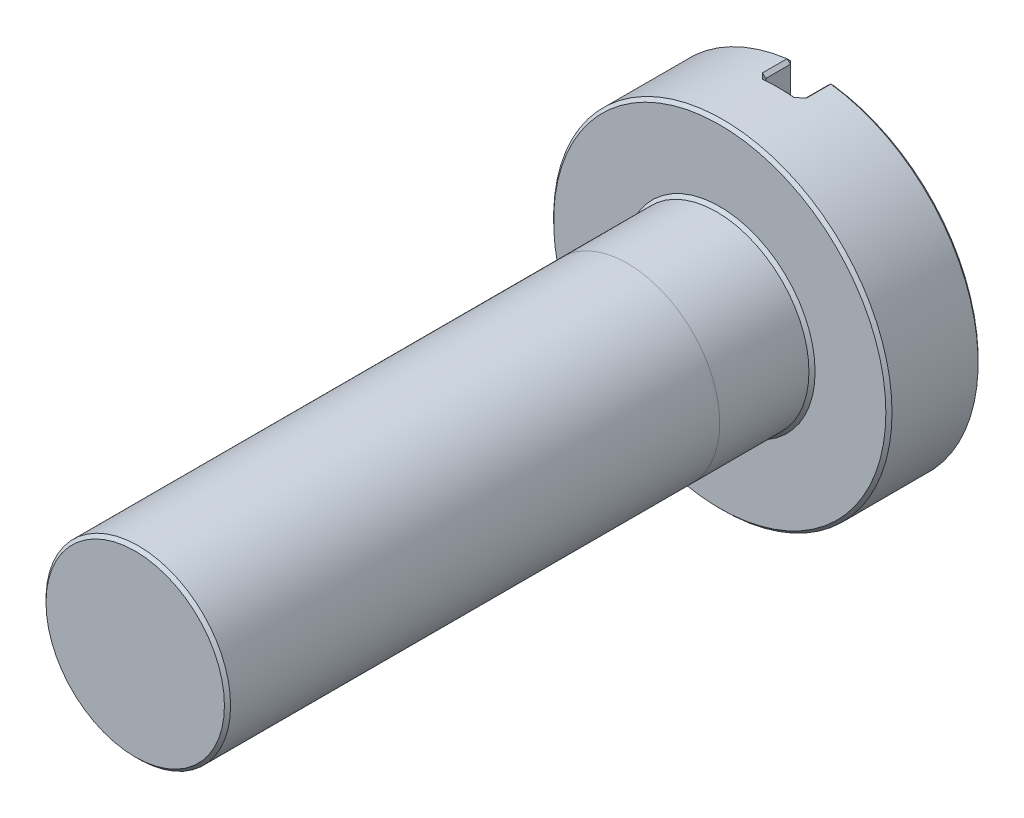
ISO-10303-21;
HEADER;
FILE_DESCRIPTION(('STEP AP214'),'2;1');
FILE_NAME('part.step','',(''),(''),'','','');
FILE_SCHEMA(('AUTOMOTIVE_DESIGN { 1 0 10303 214 1 1 1 1 }'));
ENDSEC;
DATA;
#1=APPLICATION_CONTEXT('core data for automotive mechanical design processes');
#2=APPLICATION_PROTOCOL_DEFINITION('international standard','automotive_design',2000,#1);
#3=PRODUCT_CONTEXT('',#1,'mechanical');
#4=PRODUCT('Part','Part','',(#3));
#5=PRODUCT_RELATED_PRODUCT_CATEGORY('part','',(#4));
#6=PRODUCT_DEFINITION_FORMATION('','',#4);
#7=PRODUCT_DEFINITION_CONTEXT('part definition',#1,'design');
#8=PRODUCT_DEFINITION('design','',#6,#7);
#9=PRODUCT_DEFINITION_SHAPE('','',#8);
#10=(LENGTH_UNIT() NAMED_UNIT(*) SI_UNIT(.MILLI.,.METRE.));
#11=(NAMED_UNIT(*) PLANE_ANGLE_UNIT() SI_UNIT($,.RADIAN.));
#12=(NAMED_UNIT(*) SI_UNIT($,.STERADIAN.) SOLID_ANGLE_UNIT());
#13=UNCERTAINTY_MEASURE_WITH_UNIT(LENGTH_MEASURE(1.E-05),#10,'distance_accuracy_value','');
#14=(GEOMETRIC_REPRESENTATION_CONTEXT(3) GLOBAL_UNCERTAINTY_ASSIGNED_CONTEXT((#13)) GLOBAL_UNIT_ASSIGNED_CONTEXT((#10,
#11,#12)) REPRESENTATION_CONTEXT('',''));
#15=CARTESIAN_POINT('',(0.,0.,0.));
#16=DIRECTION('',(0.,0.,1.));
#17=DIRECTION('',(1.,0.,0.));
#18=AXIS2_PLACEMENT_3D('',#15,#16,#17);
#19=CARTESIAN_POINT('',(0.,0.,11.));
#20=DIRECTION('',(0.,0.,-1.));
#21=DIRECTION('',(-1.,0.,0.));
#22=AXIS2_PLACEMENT_3D('',#19,#20,#21);
#23=CYLINDRICAL_SURFACE('',#22,1.5);
#24=CARTESIAN_POINT('',(0.,0.,10.95));
#25=DIRECTION('',(0.,0.,1.));
#26=DIRECTION('',(1.,0.,0.));
#27=AXIS2_PLACEMENT_3D('',#24,#25,#26);
#28=CIRCLE('',#27,1.5);
#29=CARTESIAN_POINT('',(1.5,0.,10.95));
#30=VERTEX_POINT('',#29);
#31=EDGE_CURVE('E202',#30,#30,#28,.F.);
#32=ORIENTED_EDGE('',*,*,#31,.T.);
#33=EDGE_LOOP('',(#32));
#34=FACE_BOUND('',#33,.T.);
#35=CARTESIAN_POINT('',(0.,0.,3.));
#36=DIRECTION('',(0.,0.,-1.));
#37=DIRECTION('',(0.,1.,0.));
#38=AXIS2_PLACEMENT_3D('',#35,#36,#37);
#39=CIRCLE('',#38,1.5);
#40=CARTESIAN_POINT('',(0.,1.5,3.));
#41=VERTEX_POINT('',#40);
#42=EDGE_CURVE('E11',#41,#41,#39,.T.);
#43=ORIENTED_EDGE('',*,*,#42,.F.);
#44=EDGE_LOOP('',(#43));
#45=FACE_BOUND('',#44,.T.);
#46=ADVANCED_FACE('F39',(#34,#45),#23,.T.);
#47=CARTESIAN_POINT('',(0.,0.,1.5));
#48=DIRECTION('',(0.,0.,-1.));
#49=DIRECTION('',(-1.,0.,0.));
#50=AXIS2_PLACEMENT_3D('',#47,#48,#49);
#51=CYLINDRICAL_SURFACE('',#50,2.75);
#52=CARTESIAN_POINT('',(0.,0.,1.45));
#53=DIRECTION('',(0.,0.,1.));
#54=DIRECTION('',(1.,0.,0.));
#55=AXIS2_PLACEMENT_3D('',#52,#53,#54);
#56=CIRCLE('',#55,2.75);
#57=CARTESIAN_POINT('',(2.75,0.,1.45));
#58=VERTEX_POINT('',#57);
#59=EDGE_CURVE('E49',#58,#58,#56,.F.);
#60=ORIENTED_EDGE('',*,*,#59,.T.);
#61=EDGE_LOOP('',(#60));
#62=FACE_BOUND('',#61,.T.);
#63=CARTESIAN_POINT('',(-0.356481481481479,2.72679683023154,0.450000000000001));
#64=CARTESIAN_POINT('',(-0.347664395842462,2.72794946380013,0.458821927935448));
#65=CARTESIAN_POINT('',(-0.338825123640228,2.7290615860206,0.467627014180514));
#66=CARTESIAN_POINT('',(-0.321099028338335,2.73120398569253,0.485199200221923));
#67=CARTESIAN_POINT('',(-0.312212205212935,2.73223426309969,0.493966299997698));
#68=CARTESIAN_POINT('',(-0.287162841256097,2.73501387422918,0.518548436412304));
#69=CARTESIAN_POINT('',(-0.270942516358511,2.73666902458203,0.534315281910176));
#70=CARTESIAN_POINT('',(-0.254629629631053,2.73818621567523,0.549999999998603));
#71=B_SPLINE_CURVE_WITH_KNOTS('',3,(#63,#64,#65,#66,#67,#68,#69,#70),.UNSPECIFIED.,.F.,.F.,(4,2,
2,4),(0.,0.0375773794297721,0.0751547792021246,0.143195721894395),.UNSPECIFIED.);
#72=CARTESIAN_POINT('',(-0.356481481481479,2.72679683023154,0.450000000000001));
#73=VERTEX_POINT('',#72);
#74=CARTESIAN_POINT('',(-0.254629629629631,2.73818621567538,0.549999999999999));
#75=VERTEX_POINT('',#74);
#76=EDGE_CURVE('E530',#73,#75,#71,.T.);
#77=ORIENTED_EDGE('',*,*,#76,.F.);
#78=DIRECTION('',(0.,0.,-1.));
#79=VECTOR('',#78,1.);
#80=CARTESIAN_POINT('',(-0.356481481481479,2.72679683023154,1.5));
#81=LINE('',#80,#79);
#82=CARTESIAN_POINT('',(-0.356481481481479,2.72679683023154,0.0499999999999997));
#83=VERTEX_POINT('',#82);
#84=EDGE_CURVE('E536',#73,#83,#81,.T.);
#85=ORIENTED_EDGE('',*,*,#84,.T.);
#86=CARTESIAN_POINT('',(0.,0.,0.0499999999999997));
#87=DIRECTION('',(0.,0.,1.));
#88=DIRECTION('',(1.,0.,0.));
#89=AXIS2_PLACEMENT_3D('',#86,#87,#88);
#90=CIRCLE('',#89,2.75);
#91=CARTESIAN_POINT('',(-0.356481481481479,-2.72679683023154,0.0499999999999997));
#92=VERTEX_POINT('',#91);
#93=EDGE_CURVE('E616',#83,#92,#90,.T.);
#94=ORIENTED_EDGE('',*,*,#93,.T.);
#95=DIRECTION('',(0.,0.,-1.));
#96=VECTOR('',#95,1.);
#97=CARTESIAN_POINT('',(-0.356481481481479,-2.72679683023154,1.5));
#98=LINE('',#97,#96);
#99=CARTESIAN_POINT('',(-0.356481481481479,-2.72679683023154,0.450000000000001));
#100=VERTEX_POINT('',#99);
#101=EDGE_CURVE('E578',#92,#100,#98,.F.);
#102=ORIENTED_EDGE('',*,*,#101,.T.);
#103=CARTESIAN_POINT('',(-0.254629629629631,-2.73818621567538,0.549999999999999));
#104=CARTESIAN_POINT('',(-0.263638943794522,-2.73734837041016,0.541338087504837));
#105=CARTESIAN_POINT('',(-0.272619899169562,-2.73646840241962,0.532650874702281));
#106=CARTESIAN_POINT('',(-0.290528422567071,-2.73462508679491,0.515230394982543));
#107=CARTESIAN_POINT('',(-0.299455990634111,-2.73366173923035,0.50649712810382));
#108=CARTESIAN_POINT('',(-0.324478250116621,-2.73083811004551,0.481892309083159));
#109=CARTESIAN_POINT('',(-0.340515929031503,-2.72888381956303,0.465973451196003));
#110=CARTESIAN_POINT('',(-0.356481481481479,-2.72679683023154,0.450000000000001));
#111=B_SPLINE_CURVE_WITH_KNOTS('',3,(#103,#104,#105,#106,#107,#108,#109,#110),.UNSPECIFIED.,.F.,
.F.,(4,2,2,4),(0.,0.0375774596881568,0.0751548880003303,0.143195791124035),.UNSPECIFIED.);
#112=CARTESIAN_POINT('',(-0.254629629629631,-2.73818621567538,0.549999999999999));
#113=VERTEX_POINT('',#112);
#114=EDGE_CURVE('E571',#113,#100,#111,.T.);
#115=ORIENTED_EDGE('',*,*,#114,.F.);
#116=CARTESIAN_POINT('',(0.,0.,0.549999999999999));
#117=DIRECTION('',(0.,0.,-1.));
#118=DIRECTION('',(-1.,0.,0.));
#119=AXIS2_PLACEMENT_3D('',#116,#117,#118);
#120=CIRCLE('',#119,2.75);
#121=CARTESIAN_POINT('',(0.254629629629631,-2.73818621567538,0.549999999999999));
#122=VERTEX_POINT('',#121);
#123=EDGE_CURVE('E630',#113,#122,#120,.F.);
#124=ORIENTED_EDGE('',*,*,#123,.T.);
#125=CARTESIAN_POINT('',(0.35648148148148,-2.72679683023154,0.450000000000001));
#126=CARTESIAN_POINT('',(0.347664395842463,-2.72794946380013,0.458821927935448));
#127=CARTESIAN_POINT('',(0.338825123640229,-2.7290615860206,0.467627014180514));
#128=CARTESIAN_POINT('',(0.321099028338335,-2.73120398569253,0.485199200221923));
#129=CARTESIAN_POINT('',(0.312212205212936,-2.73223426309969,0.493966299997698));
#130=CARTESIAN_POINT('',(0.287162841256098,-2.73501387422918,0.518548436412304));
#131=CARTESIAN_POINT('',(0.270942516358511,-2.73666902458203,0.534315281910176));
#132=CARTESIAN_POINT('',(0.254629629631053,-2.73818621567523,0.549999999998604));
#133=B_SPLINE_CURVE_WITH_KNOTS('',3,(#125,#126,#127,#128,#129,#130,#131,#132),.UNSPECIFIED.,.F.,
.F.,(4,2,2,4),(0.,0.0375773794297721,0.0751547792021247,0.143195721894396),.UNSPECIFIED.);
#134=CARTESIAN_POINT('',(0.35648148148148,-2.72679683023154,0.450000000000001));
#135=VERTEX_POINT('',#134);
#136=EDGE_CURVE('E146',#135,#122,#133,.T.);
#137=ORIENTED_EDGE('',*,*,#136,.F.);
#138=DIRECTION('',(0.,0.,-1.));
#139=VECTOR('',#138,1.);
#140=CARTESIAN_POINT('',(0.35648148148148,-2.72679683023154,1.5));
#141=LINE('',#140,#139);
#142=CARTESIAN_POINT('',(0.35648148148148,-2.72679683023154,0.0499999999999997));
#143=VERTEX_POINT('',#142);
#144=EDGE_CURVE('E141',#135,#143,#141,.T.);
#145=ORIENTED_EDGE('',*,*,#144,.T.);
#146=CARTESIAN_POINT('',(0.,0.,0.0499999999999997));
#147=DIRECTION('',(0.,0.,1.));
#148=DIRECTION('',(1.,0.,0.));
#149=AXIS2_PLACEMENT_3D('',#146,#147,#148);
#150=CIRCLE('',#149,2.75);
#151=CARTESIAN_POINT('',(0.356481481481479,2.72679683023154,0.0499999999999997));
#152=VERTEX_POINT('',#151);
#153=EDGE_CURVE('E144',#143,#152,#150,.T.);
#154=ORIENTED_EDGE('',*,*,#153,.T.);
#155=DIRECTION('',(0.,0.,-1.));
#156=VECTOR('',#155,1.);
#157=CARTESIAN_POINT('',(0.356481481481479,2.72679683023154,1.5));
#158=LINE('',#157,#156);
#159=CARTESIAN_POINT('',(0.356481481481479,2.72679683023154,0.450000000000001));
#160=VERTEX_POINT('',#159);
#161=EDGE_CURVE('E151',#152,#160,#158,.F.);
#162=ORIENTED_EDGE('',*,*,#161,.T.);
#163=CARTESIAN_POINT('',(0.254629629629631,2.73818621567538,0.549999999999999));
#164=CARTESIAN_POINT('',(0.263638943794522,2.73734837041016,0.541338087504837));
#165=CARTESIAN_POINT('',(0.272619899169562,2.73646840241962,0.532650874702281));
#166=CARTESIAN_POINT('',(0.290528422567071,2.73462508679491,0.515230394982543));
#167=CARTESIAN_POINT('',(0.299455990634111,2.73366173923035,0.50649712810382));
#168=CARTESIAN_POINT('',(0.324478250116621,2.73083811004551,0.481892309083159));
#169=CARTESIAN_POINT('',(0.340515929031503,2.72888381956303,0.465973451196003));
#170=CARTESIAN_POINT('',(0.356481481481479,2.72679683023154,0.450000000000001));
#171=B_SPLINE_CURVE_WITH_KNOTS('',3,(#163,#164,#165,#166,#167,#168,#169,#170),.UNSPECIFIED.,.F.,
.F.,(4,2,2,4),(0.,0.0375774596881568,0.0751548880003303,0.143195791124035),.UNSPECIFIED.);
#172=CARTESIAN_POINT('',(0.254629629629631,2.73818621567538,0.549999999999999));
#173=VERTEX_POINT('',#172);
#174=EDGE_CURVE('E564',#173,#160,#171,.T.);
#175=ORIENTED_EDGE('',*,*,#174,.F.);
#176=CARTESIAN_POINT('',(0.,0.,0.549999999999999));
#177=DIRECTION('',(0.,0.,-1.));
#178=DIRECTION('',(-1.,0.,0.));
#179=AXIS2_PLACEMENT_3D('',#176,#177,#178);
#180=CIRCLE('',#179,2.75);
#181=EDGE_CURVE('E410',#173,#75,#180,.F.);
#182=ORIENTED_EDGE('',*,*,#181,.T.);
#183=EDGE_LOOP('',(#77,#85,#94,#102,#115,#124,#137,#145,#154,#162,#175,#182));
#184=FACE_BOUND('',#183,.T.);
#185=ADVANCED_FACE('F143',(#62,#184),#51,.T.);
#186=CARTESIAN_POINT('',(0.,0.,0.));
#187=DIRECTION('',(0.,0.,1.));
#188=DIRECTION('',(1.,0.,0.));
#189=AXIS2_PLACEMENT_3D('',#186,#187,#188);
#190=PLANE('',#189);
#191=CARTESIAN_POINT('',(0.,0.,0.));
#192=DIRECTION('',(0.,0.,1.));
#193=DIRECTION('',(1.,0.,0.));
#194=AXIS2_PLACEMENT_3D('',#191,#192,#193);
#195=CIRCLE('',#194,2.7);
#196=CARTESIAN_POINT('',(0.35,2.67721870604551,0.));
#197=VERTEX_POINT('',#196);
#198=CARTESIAN_POINT('',(0.35,-2.67721870604551,0.));
#199=VERTEX_POINT('',#198);
#200=EDGE_CURVE('E55',#197,#199,#195,.F.);
#201=ORIENTED_EDGE('',*,*,#200,.T.);
#202=DIRECTION('',(0.,1.,0.));
#203=VECTOR('',#202,1.);
#204=CARTESIAN_POINT('',(0.35,0.,0.));
#205=LINE('',#204,#203);
#206=EDGE_CURVE('E199',#199,#197,#205,.T.);
#207=ORIENTED_EDGE('',*,*,#206,.T.);
#208=EDGE_LOOP('',(#201,#207));
#209=FACE_BOUND('',#208,.T.);
#210=ADVANCED_FACE('F234',(#209),#190,.F.);
#211=ORIENTED_EDGE('',*,*,#42,.T.);
#212=EDGE_LOOP('',(#211));
#213=FACE_BOUND('',#212,.T.);
#214=CARTESIAN_POINT('',(0.,0.,1.55));
#215=DIRECTION('',(0.,0.,1.));
#216=DIRECTION('',(1.,0.,0.));
#217=AXIS2_PLACEMENT_3D('',#214,#215,#216);
#218=CIRCLE('',#217,1.5);
#219=CARTESIAN_POINT('',(1.5,0.,1.55));
#220=VERTEX_POINT('',#219);
#221=EDGE_CURVE('E198',#220,#220,#218,.T.);
#222=ORIENTED_EDGE('',*,*,#221,.T.);
#223=EDGE_LOOP('',(#222));
#224=FACE_BOUND('',#223,.T.);
#225=ADVANCED_FACE('F232',(#213,#224),#23,.T.);
#226=CARTESIAN_POINT('',(0.,0.,11.));
#227=DIRECTION('',(0.,0.,1.));
#228=DIRECTION('',(1.,0.,0.));
#229=AXIS2_PLACEMENT_3D('',#226,#227,#228);
#230=PLANE('',#229);
#231=CARTESIAN_POINT('',(0.,0.,11.));
#232=DIRECTION('',(0.,0.,1.));
#233=DIRECTION('',(1.,0.,0.));
#234=AXIS2_PLACEMENT_3D('',#231,#232,#233);
#235=CIRCLE('',#234,1.45);
#236=CARTESIAN_POINT('',(1.45,0.,11.));
#237=VERTEX_POINT('',#236);
#238=EDGE_CURVE('E195',#237,#237,#235,.T.);
#239=ORIENTED_EDGE('',*,*,#238,.T.);
#240=EDGE_LOOP('',(#239));
#241=FACE_BOUND('',#240,.T.);
#242=ADVANCED_FACE('F224',(#241),#230,.T.);
#243=CARTESIAN_POINT('',(0.,0.,1.5));
#244=DIRECTION('',(0.,0.,1.));
#245=DIRECTION('',(1.,0.,0.));
#246=AXIS2_PLACEMENT_3D('',#243,#244,#245);
#247=PLANE('',#246);
#248=CARTESIAN_POINT('',(0.,0.,1.5));
#249=DIRECTION('',(0.,0.,1.));
#250=DIRECTION('',(1.,0.,0.));
#251=AXIS2_PLACEMENT_3D('',#248,#249,#250);
#252=CIRCLE('',#251,2.7);
#253=CARTESIAN_POINT('',(2.7,0.,1.5));
#254=VERTEX_POINT('',#253);
#255=EDGE_CURVE('E208',#254,#254,#252,.T.);
#256=ORIENTED_EDGE('',*,*,#255,.T.);
#257=EDGE_LOOP('',(#256));
#258=FACE_BOUND('',#257,.T.);
#259=CARTESIAN_POINT('',(0.,0.,1.5));
#260=DIRECTION('',(0.,0.,1.));
#261=DIRECTION('',(1.,0.,0.));
#262=AXIS2_PLACEMENT_3D('',#259,#260,#261);
#263=CIRCLE('',#262,1.55);
#264=CARTESIAN_POINT('',(1.55,0.,1.5));
#265=VERTEX_POINT('',#264);
#266=EDGE_CURVE('E205',#265,#265,#263,.F.);
#267=ORIENTED_EDGE('',*,*,#266,.T.);
#268=EDGE_LOOP('',(#267));
#269=FACE_BOUND('',#268,.T.);
#270=ADVANCED_FACE('F220',(#258,#269),#247,.T.);
#271=CARTESIAN_POINT('',(0.,0.,0.));
#272=DIRECTION('',(0.,0.,1.));
#273=DIRECTION('',(1.,0.,0.));
#274=AXIS2_PLACEMENT_3D('',#271,#272,#273);
#275=CIRCLE('',#274,2.7);
#276=CARTESIAN_POINT('',(-0.35,-2.67721870604551,0.));
#277=VERTEX_POINT('',#276);
#278=CARTESIAN_POINT('',(-0.35,2.67721870604551,0.));
#279=VERTEX_POINT('',#278);
#280=EDGE_CURVE('E428',#277,#279,#275,.F.);
#281=ORIENTED_EDGE('',*,*,#280,.T.);
#282=DIRECTION('',(0.,-1.,0.));
#283=VECTOR('',#282,1.);
#284=CARTESIAN_POINT('',(-0.35,0.,0.));
#285=LINE('',#284,#283);
#286=EDGE_CURVE('E430',#279,#277,#285,.T.);
#287=ORIENTED_EDGE('',*,*,#286,.T.);
#288=EDGE_LOOP('',(#281,#287));
#289=FACE_BOUND('',#288,.T.);
#290=ADVANCED_FACE('F223',(#289),#190,.F.);
#291=CARTESIAN_POINT('',(0.,0.,0.5));
#292=DIRECTION('',(0.,0.,-1.));
#293=DIRECTION('',(-1.,0.,0.));
#294=AXIS2_PLACEMENT_3D('',#291,#292,#293);
#295=PLANE('',#294);
#296=CARTESIAN_POINT('',(0.,0.,0.5));
#297=DIRECTION('',(0.,0.,-1.));
#298=DIRECTION('',(-1.,0.,0.));
#299=AXIS2_PLACEMENT_3D('',#296,#297,#298);
#300=CIRCLE('',#299,2.7);
#301=CARTESIAN_POINT('',(0.250000000000002,-2.68840101175402,0.5));
#302=VERTEX_POINT('',#301);
#303=CARTESIAN_POINT('',(-0.250000000000002,-2.68840101175402,0.5));
#304=VERTEX_POINT('',#303);
#305=EDGE_CURVE('E419',#302,#304,#300,.T.);
#306=ORIENTED_EDGE('',*,*,#305,.T.);
#307=DIRECTION('',(0.,1.,0.));
#308=VECTOR('',#307,1.);
#309=CARTESIAN_POINT('',(-0.250000000000002,0.,0.5));
#310=LINE('',#309,#308);
#311=CARTESIAN_POINT('',(-0.250000000000002,2.68840101175402,0.5));
#312=VERTEX_POINT('',#311);
#313=EDGE_CURVE('E421',#304,#312,#310,.T.);
#314=ORIENTED_EDGE('',*,*,#313,.T.);
#315=CARTESIAN_POINT('',(0.,0.,0.5));
#316=DIRECTION('',(0.,0.,-1.));
#317=DIRECTION('',(-1.,0.,0.));
#318=AXIS2_PLACEMENT_3D('',#315,#316,#317);
#319=CIRCLE('',#318,2.7);
#320=CARTESIAN_POINT('',(0.250000000000002,2.68840101175402,0.5));
#321=VERTEX_POINT('',#320);
#322=EDGE_CURVE('E408',#312,#321,#319,.T.);
#323=ORIENTED_EDGE('',*,*,#322,.T.);
#324=DIRECTION('',(0.,-1.,0.));
#325=VECTOR('',#324,1.);
#326=CARTESIAN_POINT('',(0.250000000000002,0.,0.5));
#327=LINE('',#326,#325);
#328=EDGE_CURVE('E416',#321,#302,#327,.T.);
#329=ORIENTED_EDGE('',*,*,#328,.T.);
#330=EDGE_LOOP('',(#306,#314,#323,#329));
#331=FACE_BOUND('',#330,.T.);
#332=ADVANCED_FACE('F666',(#331),#295,.T.);
#333=CARTESIAN_POINT('',(0.3,-2.97219755952938,0.5));
#334=DIRECTION('',(1.,0.,0.));
#335=DIRECTION('',(0.,0.,-1.));
#336=AXIS2_PLACEMENT_3D('',#333,#334,#335);
#337=PLANE('',#336);
#338=DIRECTION('',(0.,0.,1.));
#339=VECTOR('',#338,1.);
#340=CARTESIAN_POINT('',(0.3,-2.67721870604551,0.5));
#341=LINE('',#340,#339);
#342=CARTESIAN_POINT('',(0.3,-2.67721870604551,0.0499999999999997));
#343=VERTEX_POINT('',#342);
#344=CARTESIAN_POINT('',(0.3,-2.67721870604551,0.450000000000001));
#345=VERTEX_POINT('',#344);
#346=EDGE_CURVE('E171',#343,#345,#341,.T.);
#347=ORIENTED_EDGE('',*,*,#346,.T.);
#348=DIRECTION('',(0.,1.,0.));
#349=VECTOR('',#348,1.);
#350=CARTESIAN_POINT('',(0.3,-2.97219755952938,0.450000000000001));
#351=LINE('',#350,#349);
#352=CARTESIAN_POINT('',(0.3,2.67721870604551,0.450000000000001));
#353=VERTEX_POINT('',#352);
#354=EDGE_CURVE('E423',#345,#353,#351,.T.);
#355=ORIENTED_EDGE('',*,*,#354,.T.);
#356=DIRECTION('',(0.,0.,-1.));
#357=VECTOR('',#356,1.);
#358=CARTESIAN_POINT('',(0.3,2.67721870604551,0.5));
#359=LINE('',#358,#357);
#360=CARTESIAN_POINT('',(0.3,2.67721870604551,0.0499999999999997));
#361=VERTEX_POINT('',#360);
#362=EDGE_CURVE('E656',#353,#361,#359,.T.);
#363=ORIENTED_EDGE('',*,*,#362,.T.);
#364=DIRECTION('',(0.,-1.,0.));
#365=VECTOR('',#364,1.);
#366=CARTESIAN_POINT('',(0.3,-2.97219755952938,0.0499999999999997));
#367=LINE('',#366,#365);
#368=EDGE_CURVE('E652',#361,#343,#367,.T.);
#369=ORIENTED_EDGE('',*,*,#368,.T.);
#370=EDGE_LOOP('',(#347,#355,#363,#369));
#371=FACE_BOUND('',#370,.T.);
#372=ADVANCED_FACE('F660',(#371),#337,.F.);
#373=CARTESIAN_POINT('',(-0.3,-2.97219755952938,0.5));
#374=DIRECTION('',(-1.,0.,0.));
#375=DIRECTION('',(0.,0.,1.));
#376=AXIS2_PLACEMENT_3D('',#373,#374,#375);
#377=PLANE('',#376);
#378=DIRECTION('',(0.,0.,1.));
#379=VECTOR('',#378,1.);
#380=CARTESIAN_POINT('',(-0.3,2.67721870604551,0.5));
#381=LINE('',#380,#379);
#382=CARTESIAN_POINT('',(-0.3,2.67721870604551,0.0499999999999997));
#383=VERTEX_POINT('',#382);
#384=CARTESIAN_POINT('',(-0.3,2.67721870604551,0.450000000000001));
#385=VERTEX_POINT('',#384);
#386=EDGE_CURVE('E538',#383,#385,#381,.T.);
#387=ORIENTED_EDGE('',*,*,#386,.T.);
#388=DIRECTION('',(0.,-1.,0.));
#389=VECTOR('',#388,1.);
#390=CARTESIAN_POINT('',(-0.3,-2.97219755952938,0.450000000000001));
#391=LINE('',#390,#389);
#392=CARTESIAN_POINT('',(-0.3,-2.67721870604551,0.450000000000001));
#393=VERTEX_POINT('',#392);
#394=EDGE_CURVE('E650',#385,#393,#391,.T.);
#395=ORIENTED_EDGE('',*,*,#394,.T.);
#396=DIRECTION('',(0.,0.,-1.));
#397=VECTOR('',#396,1.);
#398=CARTESIAN_POINT('',(-0.3,-2.67721870604551,0.5));
#399=LINE('',#398,#397);
#400=CARTESIAN_POINT('',(-0.3,-2.67721870604551,0.0499999999999997));
#401=VERTEX_POINT('',#400);
#402=EDGE_CURVE('E648',#393,#401,#399,.T.);
#403=ORIENTED_EDGE('',*,*,#402,.T.);
#404=DIRECTION('',(0.,1.,0.));
#405=VECTOR('',#404,1.);
#406=CARTESIAN_POINT('',(-0.3,-2.97219755952938,0.0499999999999997));
#407=LINE('',#406,#405);
#408=EDGE_CURVE('E535',#401,#383,#407,.T.);
#409=ORIENTED_EDGE('',*,*,#408,.T.);
#410=EDGE_LOOP('',(#387,#395,#403,#409));
#411=FACE_BOUND('',#410,.T.);
#412=ADVANCED_FACE('F284',(#411),#377,.F.);
#413=CARTESIAN_POINT('',(0.3,2.67721870604551,0.0499999999999997));
#414=DIRECTION('',(-0.550659428732147,0.627334350324258,-0.550659428732158));
#415=DIRECTION('',(0.,0.659685671502122,0.751541625470469));
#416=AXIS2_PLACEMENT_3D('',#413,#414,#415);
#417=PLANE('',#416);
#418=DIRECTION('',(0.751541625470475,0.659685671502115,0.));
#419=VECTOR('',#418,1.);
#420=CARTESIAN_POINT('',(0.3,2.67721870604551,0.0499999999999997));
#421=LINE('',#420,#419);
#422=EDGE_CURVE('E167',#152,#361,#421,.F.);
#423=ORIENTED_EDGE('',*,*,#422,.F.);
#424=DIRECTION('',(-0.091661990153784,-0.701140556208987,-0.707106781186547));
#425=VECTOR('',#424,1.);
#426=CARTESIAN_POINT('',(0.,0.,-2.69999999999996));
#427=LINE('',#426,#425);
#428=EDGE_CURVE('E157',#197,#152,#427,.F.);
#429=ORIENTED_EDGE('',*,*,#428,.F.);
#430=DIRECTION('',(0.707106781186548,0.,-0.707106781186548));
#431=VECTOR('',#430,1.);
#432=CARTESIAN_POINT('',(0.3,2.67721870604551,0.0499999999999997));
#433=LINE('',#432,#431);
#434=EDGE_CURVE('E191',#361,#197,#433,.T.);
#435=ORIENTED_EDGE('',*,*,#434,.F.);
#436=EDGE_LOOP('',(#423,#429,#435));
#437=FACE_BOUND('',#436,.T.);
#438=ADVANCED_FACE('F273',(#437),#417,.T.);
#439=CARTESIAN_POINT('',(0.,0.,0.0499999999999997));
#440=DIRECTION('',(0.,0.,1.));
#441=DIRECTION('',(1.,0.,0.));
#442=AXIS2_PLACEMENT_3D('',#439,#440,#441);
#443=CONICAL_SURFACE('',#442,2.75,0.785398163397448);
#444=ORIENTED_EDGE('',*,*,#428,.T.);
#445=ORIENTED_EDGE('',*,*,#153,.F.);
#446=DIRECTION('',(0.0916619901537935,-0.701140556208986,0.707106781186547));
#447=VECTOR('',#446,1.);
#448=CARTESIAN_POINT('',(0.,0.,-2.69999999999998));
#449=LINE('',#448,#447);
#450=EDGE_CURVE('E155',#199,#143,#449,.T.);
#451=ORIENTED_EDGE('',*,*,#450,.F.);
#452=ORIENTED_EDGE('',*,*,#200,.F.);
#453=EDGE_LOOP('',(#444,#445,#451,#452));
#454=FACE_BOUND('',#453,.T.);
#455=ADVANCED_FACE('F154',(#454),#443,.T.);
#456=CARTESIAN_POINT('',(0.35,0.,0.));
#457=DIRECTION('',(0.707106781186548,0.,0.707106781186548));
#458=DIRECTION('',(0.,1.,0.));
#459=AXIS2_PLACEMENT_3D('',#456,#457,#458);
#460=PLANE('',#459);
#461=ORIENTED_EDGE('',*,*,#434,.T.);
#462=ORIENTED_EDGE('',*,*,#206,.F.);
#463=DIRECTION('',(-0.707106781186548,0.,0.707106781186548));
#464=VECTOR('',#463,1.);
#465=CARTESIAN_POINT('',(0.328240740740739,-2.67721870604551,0.0217592592592606));
#466=LINE('',#465,#464);
#467=EDGE_CURVE('E166',#343,#199,#466,.F.);
#468=ORIENTED_EDGE('',*,*,#467,.F.);
#469=ORIENTED_EDGE('',*,*,#368,.F.);
#470=EDGE_LOOP('',(#461,#462,#468,#469));
#471=FACE_BOUND('',#470,.T.);
#472=ADVANCED_FACE('F291',(#471),#460,.F.);
#473=CARTESIAN_POINT('',(0.356481481481479,2.72679683023154,1.5));
#474=DIRECTION('',(-0.659685671502115,0.751541625470475,0.));
#475=DIRECTION('',(0.,0.,-1.));
#476=AXIS2_PLACEMENT_3D('',#473,#474,#475);
#477=PLANE('',#476);
#478=ORIENTED_EDGE('',*,*,#422,.T.);
#479=ORIENTED_EDGE('',*,*,#362,.F.);
#480=DIRECTION('',(-0.751541625470475,-0.659685671502115,0.));
#481=VECTOR('',#480,1.);
#482=CARTESIAN_POINT('',(0.356481481481479,2.72679683023154,0.450000000000001));
#483=LINE('',#482,#481);
#484=EDGE_CURVE('E172',#160,#353,#483,.T.);
#485=ORIENTED_EDGE('',*,*,#484,.F.);
#486=ORIENTED_EDGE('',*,*,#161,.F.);
#487=EDGE_LOOP('',(#478,#479,#485,#486));
#488=FACE_BOUND('',#487,.T.);
#489=ADVANCED_FACE('F297',(#488),#477,.T.);
#490=CARTESIAN_POINT('',(0.35648148148148,-2.72679683023154,0.0499999999999997));
#491=DIRECTION('',(-0.550659428732137,-0.627334350324266,-0.550659428732159));
#492=DIRECTION('',(0.,0.659685671502118,-0.751541625470472));
#493=AXIS2_PLACEMENT_3D('',#490,#491,#492);
#494=PLANE('',#493);
#495=ORIENTED_EDGE('',*,*,#467,.T.);
#496=ORIENTED_EDGE('',*,*,#450,.T.);
#497=DIRECTION('',(0.751541625470485,-0.659685671502103,0.));
#498=VECTOR('',#497,1.);
#499=CARTESIAN_POINT('',(0.35648148148148,-2.72679683023154,0.0499999999999997));
#500=LINE('',#499,#498);
#501=EDGE_CURVE('E163',#343,#143,#500,.T.);
#502=ORIENTED_EDGE('',*,*,#501,.F.);
#503=EDGE_LOOP('',(#495,#496,#502));
#504=FACE_BOUND('',#503,.T.);
#505=ADVANCED_FACE('F162',(#504),#494,.T.);
#506=CARTESIAN_POINT('',(0.250000000000002,2.68840101175402,0.5));
#507=CARTESIAN_POINT('',(0.3,2.67721870604551,0.450000000000001));
#508=CARTESIAN_POINT('',(0.254629629629631,2.73818621567538,0.549999999999999));
#509=CARTESIAN_POINT('',(0.356481481481479,2.72679683023154,0.450000000000001));
#510=CARTESIAN_POINT('',(0.254700493957954,2.73894826260323,0.550765334745886));
#511=CARTESIAN_POINT('',(0.357346026287019,2.72755570745305,0.450000000000001));
#512=B_SPLINE_SURFACE_WITH_KNOTS('',1,1,((#506,#507),(#508,#509),(#510,#511)),.UNSPECIFIED.,.F.,
.F.,.F.,(2,1,2),(2,2),(0.,1.,1.01530669491775),(0.,1.),.UNSPECIFIED.);
#513=CARTESIAN_POINT('',(0.3,2.67721870604551,0.450000000000001));
#514=CARTESIAN_POINT('',(0.295625856762105,2.67819696618349,0.454374143237896));
#515=CARTESIAN_POINT('',(0.29125171352421,2.67917522632147,0.458748286475791));
#516=CARTESIAN_POINT('',(0.28250342704842,2.68113174659743,0.467496572951582));
#517=CARTESIAN_POINT('',(0.278129283810525,2.68211000673541,0.471870716189477));
#518=CARTESIAN_POINT('',(0.265836760381754,2.68485918183359,0.484163239618248));
#519=CARTESIAN_POINT('',(0.257918380190878,2.68663009679381,0.492081619809124));
#520=CARTESIAN_POINT('',(0.250000000000002,2.68840101175402,0.5));
#521=B_SPLINE_CURVE_WITH_KNOTS('',3,(#513,#514,#515,#516,#517,#518,#519,#520),.UNSPECIFIED.,.F.,
.F.,(4,2,2,4),(0.,0.0187885406367615,0.037577081273523,0.071589412352373),.UNSPECIFIED.);
#522=EDGE_CURVE('E173',#321,#353,#521,.F.);
#523=DIRECTION('',(0.0654728501098652,0.704069105911116,0.707106781186556));
#524=VECTOR('',#523,1.);
#525=CARTESIAN_POINT('',(0.250000000000002,2.68840101175402,0.5));
#526=LINE('',#525,#524);
#527=EDGE_CURVE('E178',#173,#321,#526,.F.);
#528=ORIENTED_EDGE('',*,*,#174,.T.);
#529=ORIENTED_EDGE('',*,*,#484,.T.);
#530=ORIENTED_EDGE('',*,*,#522,.F.);
#531=ORIENTED_EDGE('',*,*,#527,.F.);
#532=EDGE_LOOP('',(#528,#529,#530,#531));
#533=FACE_BOUND('',#532,.T.);
#534=ADVANCED_FACE('F310',(#533),#512,.T.);
#535=CARTESIAN_POINT('',(0.35648148148148,-2.72679683023154,1.5));
#536=DIRECTION('',(0.659685671502103,0.751541625470485,0.));
#537=DIRECTION('',(0.,0.,-1.));
#538=AXIS2_PLACEMENT_3D('',#535,#536,#537);
#539=PLANE('',#538);
#540=ORIENTED_EDGE('',*,*,#501,.T.);
#541=ORIENTED_EDGE('',*,*,#144,.F.);
#542=DIRECTION('',(0.751541625470485,-0.659685671502103,0.));
#543=VECTOR('',#542,1.);
#544=CARTESIAN_POINT('',(0.3,-2.67721870604551,0.450000000000001));
#545=LINE('',#544,#543);
#546=EDGE_CURVE('E396',#345,#135,#545,.T.);
#547=ORIENTED_EDGE('',*,*,#546,.F.);
#548=ORIENTED_EDGE('',*,*,#346,.F.);
#549=EDGE_LOOP('',(#540,#541,#547,#548));
#550=FACE_BOUND('',#549,.T.);
#551=ADVANCED_FACE('F169',(#550),#539,.F.);
#552=CARTESIAN_POINT('',(0.250000000000002,0.,0.5));
#553=DIRECTION('',(0.707106781186554,0.,0.707106781186541));
#554=DIRECTION('',(0.,-1.,0.));
#555=AXIS2_PLACEMENT_3D('',#552,#553,#554);
#556=PLANE('',#555);
#557=ORIENTED_EDGE('',*,*,#522,.T.);
#558=ORIENTED_EDGE('',*,*,#354,.F.);
#559=CARTESIAN_POINT('',(0.250000000000002,-2.68840101175402,0.5));
#560=CARTESIAN_POINT('',(0.254374143237897,-2.68742275161604,0.495625856762105));
#561=CARTESIAN_POINT('',(0.258748286475792,-2.68644449147806,0.49125171352421));
#562=CARTESIAN_POINT('',(0.267496572951582,-2.6844879712021,0.482503427048419));
#563=CARTESIAN_POINT('',(0.271870716189477,-2.68350971106412,0.478129283810524));
#564=CARTESIAN_POINT('',(0.284163239618248,-2.68076053596593,0.465836760381753));
#565=CARTESIAN_POINT('',(0.292081619809124,-2.67898962100572,0.457918380190877));
#566=CARTESIAN_POINT('',(0.3,-2.67721870604551,0.450000000000001));
#567=B_SPLINE_CURVE_WITH_KNOTS('',3,(#559,#560,#561,#562,#563,#564,#565,#566),.UNSPECIFIED.,.F.,
.F.,(4,2,2,4),(0.,0.0187885406367616,0.0375770812735231,0.0715894123523729),.UNSPECIFIED.);
#568=EDGE_CURVE('E389',#302,#345,#567,.T.);
#569=ORIENTED_EDGE('',*,*,#568,.F.);
#570=ORIENTED_EDGE('',*,*,#328,.F.);
#571=EDGE_LOOP('',(#557,#558,#569,#570));
#572=FACE_BOUND('',#571,.T.);
#573=ADVANCED_FACE('F328',(#572),#556,.F.);
#574=CARTESIAN_POINT('',(0.,0.,0.5));
#575=DIRECTION('',(0.,0.,1.));
#576=DIRECTION('',(1.,0.,0.));
#577=AXIS2_PLACEMENT_3D('',#574,#575,#576);
#578=CONICAL_SURFACE('',#577,2.7,0.78539816339744);
#579=ORIENTED_EDGE('',*,*,#527,.T.);
#580=ORIENTED_EDGE('',*,*,#322,.F.);
#581=DIRECTION('',(0.0654728501098652,-0.704069105911116,-0.707106781186556));
#582=VECTOR('',#581,1.);
#583=CARTESIAN_POINT('',(-0.254629629629631,2.73818621567538,0.549999999999999));
#584=LINE('',#583,#582);
#585=EDGE_CURVE('E397',#75,#312,#584,.T.);
#586=ORIENTED_EDGE('',*,*,#585,.F.);
#587=ORIENTED_EDGE('',*,*,#181,.F.);
#588=EDGE_LOOP('',(#579,#580,#586,#587));
#589=FACE_BOUND('',#588,.T.);
#590=ADVANCED_FACE('F336',(#589),#578,.T.);
#591=CARTESIAN_POINT('',(-0.356481481481479,2.72679683023154,1.5));
#592=DIRECTION('',(-0.659685671502115,-0.751541625470475,0.));
#593=DIRECTION('',(0.,0.,-1.));
#594=AXIS2_PLACEMENT_3D('',#591,#592,#593);
#595=PLANE('',#594);
#596=DIRECTION('',(-0.751541625470475,0.659685671502115,0.));
#597=VECTOR('',#596,1.);
#598=CARTESIAN_POINT('',(-0.356481481481479,2.72679683023154,0.0499999999999997));
#599=LINE('',#598,#597);
#600=EDGE_CURVE('E400',#83,#383,#599,.F.);
#601=ORIENTED_EDGE('',*,*,#600,.F.);
#602=ORIENTED_EDGE('',*,*,#84,.F.);
#603=DIRECTION('',(-0.751541625470475,0.659685671502115,0.));
#604=VECTOR('',#603,1.);
#605=CARTESIAN_POINT('',(-0.3,2.67721870604551,0.450000000000001));
#606=LINE('',#605,#604);
#607=EDGE_CURVE('E533',#385,#73,#606,.T.);
#608=ORIENTED_EDGE('',*,*,#607,.F.);
#609=ORIENTED_EDGE('',*,*,#386,.F.);
#610=EDGE_LOOP('',(#601,#602,#608,#609));
#611=FACE_BOUND('',#610,.T.);
#612=ADVANCED_FACE('F347',(#611),#595,.F.);
#613=CARTESIAN_POINT('',(-0.356481481481479,2.72679683023154,0.0499999999999997));
#614=DIRECTION('',(0.550659428732147,0.627334350324258,-0.550659428732158));
#615=DIRECTION('',(0.,0.659685671502122,0.751541625470469));
#616=AXIS2_PLACEMENT_3D('',#613,#614,#615);
#617=PLANE('',#616);
#618=DIRECTION('',(-0.091661990153784,0.701140556208987,0.707106781186548));
#619=VECTOR('',#618,1.);
#620=CARTESIAN_POINT('',(0.,0.,-2.69999999999996));
#621=LINE('',#620,#619);
#622=EDGE_CURVE('E619',#83,#279,#621,.F.);
#623=ORIENTED_EDGE('',*,*,#622,.F.);
#624=ORIENTED_EDGE('',*,*,#600,.T.);
#625=DIRECTION('',(0.707106781186548,0.,0.707106781186548));
#626=VECTOR('',#625,1.);
#627=CARTESIAN_POINT('',(-0.328240740740739,2.67721870604551,0.0217592592592605));
#628=LINE('',#627,#626);
#629=EDGE_CURVE('E617',#279,#383,#628,.T.);
#630=ORIENTED_EDGE('',*,*,#629,.F.);
#631=EDGE_LOOP('',(#623,#624,#630));
#632=FACE_BOUND('',#631,.T.);
#633=ADVANCED_FACE('F354',(#632),#617,.T.);
#634=CARTESIAN_POINT('',(0.3,-2.67721870604551,0.450000000000001));
#635=CARTESIAN_POINT('',(0.250000000000002,-2.68840101175402,0.5));
#636=CARTESIAN_POINT('',(0.35648148148148,-2.72679683023154,0.450000000000001));
#637=CARTESIAN_POINT('',(0.254629629629631,-2.73818621567538,0.549999999999999));
#638=CARTESIAN_POINT('',(0.357338228851049,-2.72754886304602,0.450000000000001));
#639=CARTESIAN_POINT('',(0.254699854823858,-2.73894138960822,0.55075843209765));
#640=B_SPLINE_SURFACE_WITH_KNOTS('',1,1,((#634,#635),(#636,#637),(#638,#639)),.UNSPECIFIED.,.F.,
.F.,.F.,(2,1,2),(2,2),(0.,1.,1.01516864195302),(0.,1.),.UNSPECIFIED.);
#641=DIRECTION('',(-0.0654728501098652,0.704069105911116,-0.707106781186556));
#642=VECTOR('',#641,1.);
#643=CARTESIAN_POINT('',(0.254629629629631,-2.73818621567538,0.549999999999999));
#644=LINE('',#643,#642);
#645=EDGE_CURVE('E478',#302,#122,#644,.F.);
#646=ORIENTED_EDGE('',*,*,#546,.T.);
#647=ORIENTED_EDGE('',*,*,#136,.T.);
#648=ORIENTED_EDGE('',*,*,#645,.F.);
#649=ORIENTED_EDGE('',*,*,#568,.T.);
#650=EDGE_LOOP('',(#646,#647,#648,#649));
#651=FACE_BOUND('',#650,.T.);
#652=ADVANCED_FACE('F361',(#651),#640,.T.);
#653=CARTESIAN_POINT('',(-0.3,2.67721870604551,0.450000000000001));
#654=CARTESIAN_POINT('',(-0.250000000000002,2.68840101175402,0.5));
#655=CARTESIAN_POINT('',(-0.356481481481479,2.72679683023154,0.450000000000001));
#656=CARTESIAN_POINT('',(-0.254629629629631,2.73818621567538,0.549999999999999));
#657=CARTESIAN_POINT('',(-0.357338228851047,2.72754886304602,0.450000000000001));
#658=CARTESIAN_POINT('',(-0.254699854823858,2.73894138960822,0.55075843209765));
#659=B_SPLINE_SURFACE_WITH_KNOTS('',1,1,((#653,#654),(#655,#656),(#657,#658)),.UNSPECIFIED.,.F.,
.F.,.F.,(2,1,2),(2,2),(0.,1.,1.01516864195301),(0.,1.),.UNSPECIFIED.);
#660=CARTESIAN_POINT('',(-0.250000000000002,2.68840101175402,0.5));
#661=CARTESIAN_POINT('',(-0.254374143237897,2.68742275161604,0.495625856762105));
#662=CARTESIAN_POINT('',(-0.258748286475792,2.68644449147806,0.49125171352421));
#663=CARTESIAN_POINT('',(-0.267496572951582,2.6844879712021,0.48250342704842));
#664=CARTESIAN_POINT('',(-0.271870716189477,2.68350971106412,0.478129283810524));
#665=CARTESIAN_POINT('',(-0.284163239618248,2.68076053596593,0.465836760381753));
#666=CARTESIAN_POINT('',(-0.292081619809124,2.67898962100572,0.457918380190877));
#667=CARTESIAN_POINT('',(-0.3,2.67721870604551,0.450000000000001));
#668=B_SPLINE_CURVE_WITH_KNOTS('',3,(#660,#661,#662,#663,#664,#665,#666,#667),.UNSPECIFIED.,.F.,
.F.,(4,2,2,4),(0.,0.0187885406367614,0.037577081273523,0.071589412352373),.UNSPECIFIED.);
#669=EDGE_CURVE('E470',#385,#312,#668,.F.);
#670=ORIENTED_EDGE('',*,*,#76,.T.);
#671=ORIENTED_EDGE('',*,*,#585,.T.);
#672=ORIENTED_EDGE('',*,*,#669,.F.);
#673=ORIENTED_EDGE('',*,*,#607,.T.);
#674=EDGE_LOOP('',(#670,#671,#672,#673));
#675=FACE_BOUND('',#674,.T.);
#676=ADVANCED_FACE('F369',(#675),#659,.T.);
#677=CARTESIAN_POINT('',(-0.35,0.,0.));
#678=DIRECTION('',(-0.707106781186548,0.,0.707106781186548));
#679=DIRECTION('',(0.,-1.,0.));
#680=AXIS2_PLACEMENT_3D('',#677,#678,#679);
#681=PLANE('',#680);
#682=ORIENTED_EDGE('',*,*,#629,.T.);
#683=ORIENTED_EDGE('',*,*,#408,.F.);
#684=DIRECTION('',(-0.707106781186548,0.,-0.707106781186548));
#685=VECTOR('',#684,1.);
#686=CARTESIAN_POINT('',(-0.3,-2.67721870604551,0.0499999999999997));
#687=LINE('',#686,#685);
#688=EDGE_CURVE('E479',#277,#401,#687,.F.);
#689=ORIENTED_EDGE('',*,*,#688,.F.);
#690=ORIENTED_EDGE('',*,*,#286,.F.);
#691=EDGE_LOOP('',(#682,#683,#689,#690));
#692=FACE_BOUND('',#691,.T.);
#693=ADVANCED_FACE('F507',(#692),#681,.F.);
#694=CARTESIAN_POINT('',(0.,0.,0.0499999999999997));
#695=DIRECTION('',(0.,0.,1.));
#696=DIRECTION('',(1.,0.,0.));
#697=AXIS2_PLACEMENT_3D('',#694,#695,#696);
#698=CONICAL_SURFACE('',#697,2.75,0.785398163397448);
#699=ORIENTED_EDGE('',*,*,#622,.T.);
#700=ORIENTED_EDGE('',*,*,#280,.F.);
#701=DIRECTION('',(0.091661990153784,0.701140556208987,-0.707106781186547));
#702=VECTOR('',#701,1.);
#703=CARTESIAN_POINT('',(0.,0.,-2.69999999999996));
#704=LINE('',#703,#702);
#705=EDGE_CURVE('E636',#92,#277,#704,.T.);
#706=ORIENTED_EDGE('',*,*,#705,.F.);
#707=ORIENTED_EDGE('',*,*,#93,.F.);
#708=EDGE_LOOP('',(#699,#700,#706,#707));
#709=FACE_BOUND('',#708,.T.);
#710=ADVANCED_FACE('F500',(#709),#698,.T.);
#711=CARTESIAN_POINT('',(0.,0.,0.5));
#712=DIRECTION('',(0.,0.,1.));
#713=DIRECTION('',(1.,0.,0.));
#714=AXIS2_PLACEMENT_3D('',#711,#712,#713);
#715=CONICAL_SURFACE('',#714,2.7,0.78539816339744);
#716=ORIENTED_EDGE('',*,*,#645,.T.);
#717=ORIENTED_EDGE('',*,*,#123,.F.);
#718=DIRECTION('',(-0.0654728501098652,-0.704069105911116,0.707106781186556));
#719=VECTOR('',#718,1.);
#720=CARTESIAN_POINT('',(-0.250000000000002,-2.68840101175402,0.5));
#721=LINE('',#720,#719);
#722=EDGE_CURVE('E448',#304,#113,#721,.T.);
#723=ORIENTED_EDGE('',*,*,#722,.F.);
#724=ORIENTED_EDGE('',*,*,#305,.F.);
#725=EDGE_LOOP('',(#716,#717,#723,#724));
#726=FACE_BOUND('',#725,.T.);
#727=ADVANCED_FACE('F463',(#726),#715,.T.);
#728=CARTESIAN_POINT('',(-0.250000000000002,0.,0.5));
#729=DIRECTION('',(-0.707106781186554,0.,0.707106781186541));
#730=DIRECTION('',(0.,1.,0.));
#731=AXIS2_PLACEMENT_3D('',#728,#729,#730);
#732=PLANE('',#731);
#733=ORIENTED_EDGE('',*,*,#669,.T.);
#734=ORIENTED_EDGE('',*,*,#313,.F.);
#735=CARTESIAN_POINT('',(-0.3,-2.67721870604551,0.450000000000001));
#736=CARTESIAN_POINT('',(-0.295625856762105,-2.67819696618349,0.454374143237896));
#737=CARTESIAN_POINT('',(-0.29125171352421,-2.67917522632147,0.458748286475791));
#738=CARTESIAN_POINT('',(-0.28250342704842,-2.68113174659743,0.467496572951582));
#739=CARTESIAN_POINT('',(-0.278129283810525,-2.68211000673541,0.471870716189477));
#740=CARTESIAN_POINT('',(-0.265836760381754,-2.68485918183359,0.484163239618248));
#741=CARTESIAN_POINT('',(-0.257918380190878,-2.68663009679381,0.492081619809124));
#742=CARTESIAN_POINT('',(-0.250000000000002,-2.68840101175402,0.5));
#743=B_SPLINE_CURVE_WITH_KNOTS('',3,(#735,#736,#737,#738,#739,#740,#741,#742),.UNSPECIFIED.,.F.,
.F.,(4,2,2,4),(0.,0.0187885406367615,0.037577081273523,0.071589412352373),.UNSPECIFIED.);
#744=EDGE_CURVE('E439',#393,#304,#743,.T.);
#745=ORIENTED_EDGE('',*,*,#744,.F.);
#746=ORIENTED_EDGE('',*,*,#394,.F.);
#747=EDGE_LOOP('',(#733,#734,#745,#746));
#748=FACE_BOUND('',#747,.T.);
#749=ADVANCED_FACE('F455',(#748),#732,.F.);
#750=CARTESIAN_POINT('',(-0.3,-2.67721870604551,0.0499999999999997));
#751=DIRECTION('',(0.550659428732147,-0.627334350324258,-0.550659428732158));
#752=DIRECTION('',(0.,0.659685671502122,-0.751541625470469));
#753=AXIS2_PLACEMENT_3D('',#750,#751,#752);
#754=PLANE('',#753);
#755=ORIENTED_EDGE('',*,*,#705,.T.);
#756=ORIENTED_EDGE('',*,*,#688,.T.);
#757=DIRECTION('',(-0.751541625470475,-0.659685671502115,0.));
#758=VECTOR('',#757,1.);
#759=CARTESIAN_POINT('',(-0.3,-2.67721870604551,0.0499999999999997));
#760=LINE('',#759,#758);
#761=EDGE_CURVE('E437',#92,#401,#760,.F.);
#762=ORIENTED_EDGE('',*,*,#761,.F.);
#763=EDGE_LOOP('',(#755,#756,#762));
#764=FACE_BOUND('',#763,.T.);
#765=ADVANCED_FACE('F462',(#764),#754,.T.);
#766=CARTESIAN_POINT('',(-0.250000000000002,-2.68840101175402,0.5));
#767=CARTESIAN_POINT('',(-0.3,-2.67721870604551,0.450000000000001));
#768=CARTESIAN_POINT('',(-0.254629629629631,-2.73818621567538,0.549999999999999));
#769=CARTESIAN_POINT('',(-0.356481481481479,-2.72679683023154,0.450000000000001));
#770=CARTESIAN_POINT('',(-0.254700493957954,-2.73894826260323,0.550765334745886));
#771=CARTESIAN_POINT('',(-0.357346026287019,-2.72755570745305,0.450000000000001));
#772=B_SPLINE_SURFACE_WITH_KNOTS('',1,1,((#766,#767),(#768,#769),(#770,#771)),.UNSPECIFIED.,.F.,
.F.,.F.,(2,1,2),(2,2),(0.,1.,1.01530669491775),(0.,1.),.UNSPECIFIED.);
#773=DIRECTION('',(0.751541625470475,0.659685671502115,0.));
#774=VECTOR('',#773,1.);
#775=CARTESIAN_POINT('',(-0.356481481481479,-2.72679683023154,0.450000000000001));
#776=LINE('',#775,#774);
#777=EDGE_CURVE('E435',#393,#100,#776,.F.);
#778=ORIENTED_EDGE('',*,*,#722,.T.);
#779=ORIENTED_EDGE('',*,*,#114,.T.);
#780=ORIENTED_EDGE('',*,*,#777,.F.);
#781=ORIENTED_EDGE('',*,*,#744,.T.);
#782=EDGE_LOOP('',(#778,#779,#780,#781));
#783=FACE_BOUND('',#782,.T.);
#784=ADVANCED_FACE('F263',(#783),#772,.T.);
#785=CARTESIAN_POINT('',(-0.356481481481479,-2.72679683023154,1.5));
#786=DIRECTION('',(0.659685671502115,-0.751541625470475,0.));
#787=DIRECTION('',(0.,0.,-1.));
#788=AXIS2_PLACEMENT_3D('',#785,#786,#787);
#789=PLANE('',#788);
#790=ORIENTED_EDGE('',*,*,#761,.T.);
#791=ORIENTED_EDGE('',*,*,#402,.F.);
#792=ORIENTED_EDGE('',*,*,#777,.T.);
#793=ORIENTED_EDGE('',*,*,#101,.F.);
#794=EDGE_LOOP('',(#790,#791,#792,#793));
#795=FACE_BOUND('',#794,.T.);
#796=ADVANCED_FACE('F257',(#795),#789,.T.);
#797=CARTESIAN_POINT('',(0.,0.,11.));
#798=DIRECTION('',(0.,0.,-1.));
#799=DIRECTION('',(-1.,0.,0.));
#800=AXIS2_PLACEMENT_3D('',#797,#798,#799);
#801=CONICAL_SURFACE('',#800,1.45,0.785398163397463);
#802=ORIENTED_EDGE('',*,*,#31,.F.);
#803=EDGE_LOOP('',(#802));
#804=FACE_BOUND('',#803,.T.);
#805=ORIENTED_EDGE('',*,*,#238,.F.);
#806=EDGE_LOOP('',(#805));
#807=FACE_BOUND('',#806,.T.);
#808=ADVANCED_FACE('F217',(#804,#807),#801,.T.);
#809=CARTESIAN_POINT('',(0.,0.,1.5));
#810=DIRECTION('',(0.,0.,-1.));
#811=DIRECTION('',(-1.,0.,0.));
#812=AXIS2_PLACEMENT_3D('',#809,#810,#811);
#813=CONICAL_SURFACE('',#812,2.7,0.78539816339744);
#814=ORIENTED_EDGE('',*,*,#59,.F.);
#815=EDGE_LOOP('',(#814));
#816=FACE_BOUND('',#815,.T.);
#817=ORIENTED_EDGE('',*,*,#255,.F.);
#818=EDGE_LOOP('',(#817));
#819=FACE_BOUND('',#818,.T.);
#820=ADVANCED_FACE('F214',(#816,#819),#813,.T.);
#821=CARTESIAN_POINT('',(0.,0.,1.55));
#822=DIRECTION('',(0.,0.,-1.));
#823=DIRECTION('',(-1.,0.,0.));
#824=AXIS2_PLACEMENT_3D('',#821,#822,#823);
#825=CONICAL_SURFACE('',#824,1.5,0.785398163397448);
#826=ORIENTED_EDGE('',*,*,#266,.F.);
#827=EDGE_LOOP('',(#826));
#828=FACE_BOUND('',#827,.T.);
#829=ORIENTED_EDGE('',*,*,#221,.F.);
#830=EDGE_LOOP('',(#829));
#831=FACE_BOUND('',#830,.T.);
#832=ADVANCED_FACE('F42',(#828,#831),#825,.T.);
#833=CLOSED_SHELL('',(#46,#185,#210,#225,#242,#270,#290,#332,#372,#412,#438,#455,#472,#489,#505,
#534,#551,#573,#590,#612,#633,#652,#676,#693,#710,#727,#749,#765,#784,#796,#808,#820,#832));
#834=MANIFOLD_SOLID_BREP('B2',#833);
#835=ADVANCED_BREP_SHAPE_REPRESENTATION('',(#18,#834),#14);
#836=SHAPE_DEFINITION_REPRESENTATION(#9,#835);
ENDSEC;
END-ISO-10303-21;
